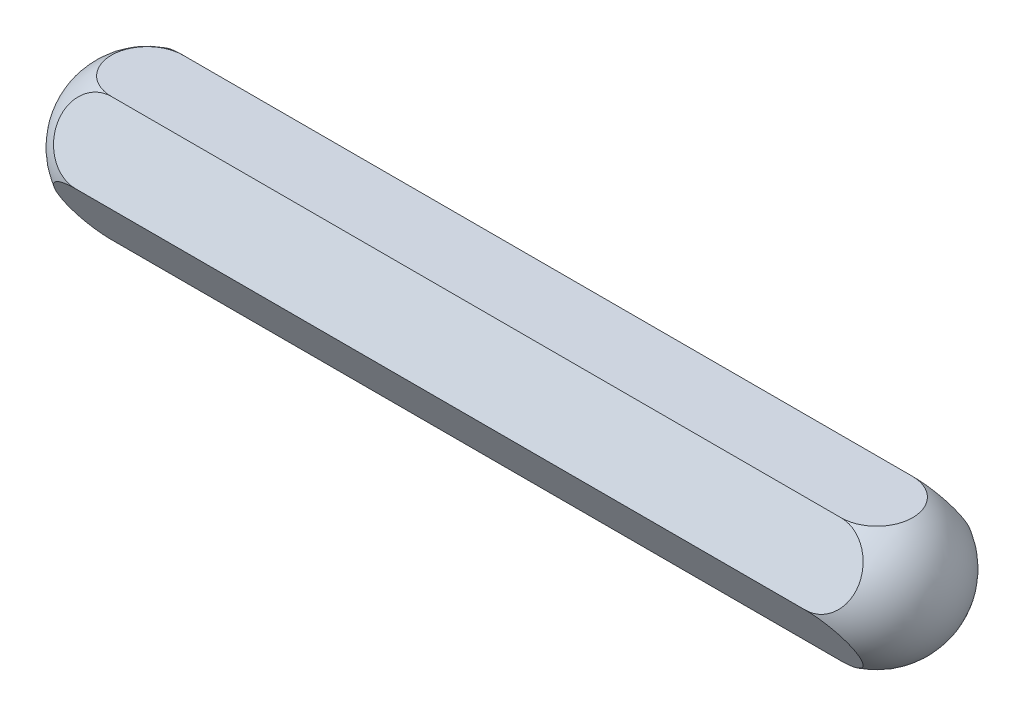
ISO-10303-21;
HEADER;
FILE_DESCRIPTION(('STEP AP214'),'2;1');
FILE_NAME('part.step','',(''),(''),'','','');
FILE_SCHEMA(('AUTOMOTIVE_DESIGN { 1 0 10303 214 1 1 1 1 }'));
ENDSEC;
DATA;
#1=APPLICATION_CONTEXT('core data for automotive mechanical design processes');
#2=APPLICATION_PROTOCOL_DEFINITION('international standard','automotive_design',2000,#1);
#3=PRODUCT_CONTEXT('',#1,'mechanical');
#4=PRODUCT('Part','Part','',(#3));
#5=PRODUCT_RELATED_PRODUCT_CATEGORY('part','',(#4));
#6=PRODUCT_DEFINITION_FORMATION('','',#4);
#7=PRODUCT_DEFINITION_CONTEXT('part definition',#1,'design');
#8=PRODUCT_DEFINITION('design','',#6,#7);
#9=PRODUCT_DEFINITION_SHAPE('','',#8);
#10=(LENGTH_UNIT() NAMED_UNIT(*) SI_UNIT(.MILLI.,.METRE.));
#11=(NAMED_UNIT(*) PLANE_ANGLE_UNIT() SI_UNIT($,.RADIAN.));
#12=(NAMED_UNIT(*) SI_UNIT($,.STERADIAN.) SOLID_ANGLE_UNIT());
#13=UNCERTAINTY_MEASURE_WITH_UNIT(LENGTH_MEASURE(1.E-05),#10,'distance_accuracy_value','');
#14=(GEOMETRIC_REPRESENTATION_CONTEXT(3) GLOBAL_UNCERTAINTY_ASSIGNED_CONTEXT((#13)) GLOBAL_UNIT_ASSIGNED_CONTEXT((#10,
#11,#12)) REPRESENTATION_CONTEXT('',''));
#15=CARTESIAN_POINT('',(0.,0.,0.));
#16=DIRECTION('',(0.,0.,1.));
#17=DIRECTION('',(1.,0.,0.));
#18=AXIS2_PLACEMENT_3D('',#15,#16,#17);
#19=CARTESIAN_POINT('',(-21.4,0.,0.));
#20=DIRECTION('',(-1.,0.,0.));
#21=DIRECTION('',(0.,1.,0.));
#22=AXIS2_PLACEMENT_3D('',#19,#20,#21);
#23=SPHERICAL_SURFACE('',#22,4.2);
#24=CARTESIAN_POINT('',(-21.4,-1.81865334794732,3.15));
#25=DIRECTION('',(0.,-0.5,0.866025403784439));
#26=DIRECTION('',(0.,-0.866025403784439,-0.5));
#27=AXIS2_PLACEMENT_3D('',#24,#25,#26);
#28=CIRCLE('',#27,2.10000000000001);
#29=CARTESIAN_POINT('',(-21.4,0.,4.2));
#30=VERTEX_POINT('',#29);
#31=CARTESIAN_POINT('',(-21.4,-3.63730669589463,2.1));
#32=VERTEX_POINT('',#31);
#33=EDGE_CURVE('E137',#30,#32,#28,.T.);
#34=ORIENTED_EDGE('',*,*,#33,.F.);
#35=CARTESIAN_POINT('',(-21.4,1.81865334794732,3.15));
#36=DIRECTION('',(0.,0.5,0.866025403784439));
#37=DIRECTION('',(0.,-0.866025403784439,0.5));
#38=AXIS2_PLACEMENT_3D('',#35,#36,#37);
#39=CIRCLE('',#38,2.1);
#40=CARTESIAN_POINT('',(-21.4,3.63730669589465,2.1));
#41=VERTEX_POINT('',#40);
#42=EDGE_CURVE('E181',#41,#30,#39,.T.);
#43=ORIENTED_EDGE('',*,*,#42,.F.);
#44=CARTESIAN_POINT('',(-21.4,3.63730669589465,0.));
#45=DIRECTION('',(0.,1.,0.));
#46=DIRECTION('',(0.,0.,1.));
#47=AXIS2_PLACEMENT_3D('',#44,#45,#46);
#48=CIRCLE('',#47,2.09999999999999);
#49=CARTESIAN_POINT('',(-21.4,3.63730669589465,-2.1));
#50=VERTEX_POINT('',#49);
#51=EDGE_CURVE('E110',#50,#41,#48,.T.);
#52=ORIENTED_EDGE('',*,*,#51,.F.);
#53=CARTESIAN_POINT('',(-21.4,1.81865334794732,-3.15));
#54=DIRECTION('',(0.,0.5,-0.866025403784439));
#55=DIRECTION('',(0.,0.866025403784439,0.5));
#56=AXIS2_PLACEMENT_3D('',#53,#54,#55);
#57=CIRCLE('',#56,2.1);
#58=CARTESIAN_POINT('',(-21.4,0.,-4.2));
#59=VERTEX_POINT('',#58);
#60=EDGE_CURVE('E169',#59,#50,#57,.T.);
#61=ORIENTED_EDGE('',*,*,#60,.F.);
#62=CARTESIAN_POINT('',(-21.4,-1.81865334794732,-3.15));
#63=DIRECTION('',(0.,-0.5,-0.866025403784439));
#64=DIRECTION('',(0.,0.866025403784439,-0.5));
#65=AXIS2_PLACEMENT_3D('',#62,#63,#64);
#66=CIRCLE('',#65,2.10000000000001);
#67=CARTESIAN_POINT('',(-21.4,-3.63730669589463,-2.1));
#68=VERTEX_POINT('',#67);
#69=EDGE_CURVE('E162',#68,#59,#66,.T.);
#70=ORIENTED_EDGE('',*,*,#69,.F.);
#71=CARTESIAN_POINT('',(-21.4,-3.63730669589463,0.));
#72=DIRECTION('',(0.,-1.,0.));
#73=DIRECTION('',(0.,0.,-1.));
#74=AXIS2_PLACEMENT_3D('',#71,#72,#73);
#75=CIRCLE('',#74,2.10000000000001);
#76=EDGE_CURVE('E153',#32,#68,#75,.T.);
#77=ORIENTED_EDGE('',*,*,#76,.F.);
#78=EDGE_LOOP('',(#34,#43,#52,#61,#70,#77));
#79=FACE_BOUND('',#78,.T.);
#80=ADVANCED_FACE('F87',(#79),#23,.T.);
#81=CARTESIAN_POINT('',(21.4,0.,0.));
#82=DIRECTION('',(-1.,0.,0.));
#83=DIRECTION('',(0.,1.,0.));
#84=AXIS2_PLACEMENT_3D('',#81,#82,#83);
#85=SPHERICAL_SURFACE('',#84,4.2);
#86=CARTESIAN_POINT('',(21.4,-1.81865334794731,3.15));
#87=DIRECTION('',(0.,-0.5,0.866025403784439));
#88=DIRECTION('',(0.,-0.866025403784439,-0.5));
#89=AXIS2_PLACEMENT_3D('',#86,#87,#88);
#90=CIRCLE('',#89,2.1);
#91=CARTESIAN_POINT('',(21.4,-3.63730669589463,2.1));
#92=VERTEX_POINT('',#91);
#93=CARTESIAN_POINT('',(21.4,0.,4.2));
#94=VERTEX_POINT('',#93);
#95=EDGE_CURVE('E102',#92,#94,#90,.T.);
#96=ORIENTED_EDGE('',*,*,#95,.F.);
#97=CARTESIAN_POINT('',(21.4,-3.63730669589463,0.));
#98=DIRECTION('',(0.,-1.,0.));
#99=DIRECTION('',(0.,0.,-1.));
#100=AXIS2_PLACEMENT_3D('',#97,#98,#99);
#101=CIRCLE('',#100,2.1);
#102=CARTESIAN_POINT('',(21.4,-3.63730669589463,-2.1));
#103=VERTEX_POINT('',#102);
#104=EDGE_CURVE('E155',#103,#92,#101,.T.);
#105=ORIENTED_EDGE('',*,*,#104,.F.);
#106=CARTESIAN_POINT('',(21.4,-1.81865334794731,-3.15));
#107=DIRECTION('',(0.,-0.5,-0.866025403784439));
#108=DIRECTION('',(0.,0.866025403784439,-0.5));
#109=AXIS2_PLACEMENT_3D('',#106,#107,#108);
#110=CIRCLE('',#109,2.1);
#111=CARTESIAN_POINT('',(21.4,0.,-4.2));
#112=VERTEX_POINT('',#111);
#113=EDGE_CURVE('E146',#112,#103,#110,.T.);
#114=ORIENTED_EDGE('',*,*,#113,.F.);
#115=CARTESIAN_POINT('',(21.4,1.81865334794733,-3.15));
#116=DIRECTION('',(0.,0.5,-0.866025403784439));
#117=DIRECTION('',(0.,0.866025403784439,0.5));
#118=AXIS2_PLACEMENT_3D('',#115,#116,#117);
#119=CIRCLE('',#118,2.1);
#120=CARTESIAN_POINT('',(21.4,3.63730669589465,-2.1));
#121=VERTEX_POINT('',#120);
#122=EDGE_CURVE('E164',#121,#112,#119,.T.);
#123=ORIENTED_EDGE('',*,*,#122,.F.);
#124=CARTESIAN_POINT('',(21.4,3.63730669589465,0.));
#125=DIRECTION('',(0.,1.,0.));
#126=DIRECTION('',(0.,0.,1.));
#127=AXIS2_PLACEMENT_3D('',#124,#125,#126);
#128=CIRCLE('',#127,2.1);
#129=CARTESIAN_POINT('',(21.4,3.63730669589465,2.1));
#130=VERTEX_POINT('',#129);
#131=EDGE_CURVE('E200',#130,#121,#128,.T.);
#132=ORIENTED_EDGE('',*,*,#131,.F.);
#133=CARTESIAN_POINT('',(21.4,1.81865334794733,3.15));
#134=DIRECTION('',(0.,0.5,0.866025403784439));
#135=DIRECTION('',(0.,-0.866025403784439,0.5));
#136=AXIS2_PLACEMENT_3D('',#133,#134,#135);
#137=CIRCLE('',#136,2.1);
#138=EDGE_CURVE('E177',#94,#130,#137,.T.);
#139=ORIENTED_EDGE('',*,*,#138,.F.);
#140=EDGE_LOOP('',(#96,#105,#114,#123,#132,#139));
#141=FACE_BOUND('',#140,.T.);
#142=ADVANCED_FACE('F198',(#141),#85,.T.);
#143=CARTESIAN_POINT('',(-25.6,-3.63730669589463,0.));
#144=DIRECTION('',(0.,-1.,0.));
#145=DIRECTION('',(0.,0.,-1.));
#146=AXIS2_PLACEMENT_3D('',#143,#144,#145);
#147=PLANE('',#146);
#148=ORIENTED_EDGE('',*,*,#76,.T.);
#149=DIRECTION('',(-1.,0.,0.));
#150=VECTOR('',#149,1.);
#151=CARTESIAN_POINT('',(-25.6,-3.63730669589463,-2.10000000000002));
#152=LINE('',#151,#150);
#153=EDGE_CURVE('E158',#68,#103,#152,.F.);
#154=ORIENTED_EDGE('',*,*,#153,.T.);
#155=ORIENTED_EDGE('',*,*,#104,.T.);
#156=DIRECTION('',(-1.,0.,0.));
#157=VECTOR('',#156,1.);
#158=CARTESIAN_POINT('',(-25.6,-3.63730669589463,2.10000000000001));
#159=LINE('',#158,#157);
#160=EDGE_CURVE('E140',#92,#32,#159,.T.);
#161=ORIENTED_EDGE('',*,*,#160,.T.);
#162=EDGE_LOOP('',(#148,#154,#155,#161));
#163=FACE_BOUND('',#162,.T.);
#164=ADVANCED_FACE('F151',(#163),#147,.T.);
#165=CARTESIAN_POINT('',(-25.6,1.81865334794732,-3.15));
#166=DIRECTION('',(0.,0.5,-0.866025403784439));
#167=DIRECTION('',(0.,0.866025403784439,0.5));
#168=AXIS2_PLACEMENT_3D('',#165,#166,#167);
#169=PLANE('',#168);
#170=ORIENTED_EDGE('',*,*,#60,.T.);
#171=DIRECTION('',(-1.,0.,0.));
#172=VECTOR('',#171,1.);
#173=CARTESIAN_POINT('',(-25.6,3.63730669589464,-2.10000000000001));
#174=LINE('',#173,#172);
#175=EDGE_CURVE('E157',#50,#121,#174,.F.);
#176=ORIENTED_EDGE('',*,*,#175,.T.);
#177=ORIENTED_EDGE('',*,*,#122,.T.);
#178=DIRECTION('',(-1.,0.,0.));
#179=VECTOR('',#178,1.);
#180=CARTESIAN_POINT('',(-25.6,0.,-4.2));
#181=LINE('',#180,#179);
#182=EDGE_CURVE('E189',#112,#59,#181,.T.);
#183=ORIENTED_EDGE('',*,*,#182,.T.);
#184=EDGE_LOOP('',(#170,#176,#177,#183));
#185=FACE_BOUND('',#184,.T.);
#186=ADVANCED_FACE('F214',(#185),#169,.T.);
#187=CARTESIAN_POINT('',(-25.6,1.81865334794732,3.15));
#188=DIRECTION('',(0.,0.5,0.866025403784439));
#189=DIRECTION('',(0.,-0.866025403784439,0.5));
#190=AXIS2_PLACEMENT_3D('',#187,#188,#189);
#191=PLANE('',#190);
#192=ORIENTED_EDGE('',*,*,#42,.T.);
#193=DIRECTION('',(-1.,0.,0.));
#194=VECTOR('',#193,1.);
#195=CARTESIAN_POINT('',(-25.6,0.,4.2));
#196=LINE('',#195,#194);
#197=EDGE_CURVE('E95',#30,#94,#196,.F.);
#198=ORIENTED_EDGE('',*,*,#197,.T.);
#199=ORIENTED_EDGE('',*,*,#138,.T.);
#200=DIRECTION('',(-1.,0.,0.));
#201=VECTOR('',#200,1.);
#202=CARTESIAN_POINT('',(-25.6,3.63730669589464,2.1));
#203=LINE('',#202,#201);
#204=EDGE_CURVE('E12',#130,#41,#203,.T.);
#205=ORIENTED_EDGE('',*,*,#204,.T.);
#206=EDGE_LOOP('',(#192,#198,#199,#205));
#207=FACE_BOUND('',#206,.T.);
#208=ADVANCED_FACE('F195',(#207),#191,.T.);
#209=CARTESIAN_POINT('',(-25.6,3.63730669589465,0.));
#210=DIRECTION('',(0.,1.,0.));
#211=DIRECTION('',(0.,0.,1.));
#212=AXIS2_PLACEMENT_3D('',#209,#210,#211);
#213=PLANE('',#212);
#214=ORIENTED_EDGE('',*,*,#51,.T.);
#215=ORIENTED_EDGE('',*,*,#204,.F.);
#216=ORIENTED_EDGE('',*,*,#131,.T.);
#217=ORIENTED_EDGE('',*,*,#175,.F.);
#218=EDGE_LOOP('',(#214,#215,#216,#217));
#219=FACE_BOUND('',#218,.T.);
#220=ADVANCED_FACE('F215',(#219),#213,.T.);
#221=CARTESIAN_POINT('',(-25.6,-1.81865334794732,-3.15));
#222=DIRECTION('',(0.,-0.5,-0.866025403784439));
#223=DIRECTION('',(0.,0.866025403784439,-0.5));
#224=AXIS2_PLACEMENT_3D('',#221,#222,#223);
#225=PLANE('',#224);
#226=ORIENTED_EDGE('',*,*,#69,.T.);
#227=ORIENTED_EDGE('',*,*,#182,.F.);
#228=ORIENTED_EDGE('',*,*,#113,.T.);
#229=ORIENTED_EDGE('',*,*,#153,.F.);
#230=EDGE_LOOP('',(#226,#227,#228,#229));
#231=FACE_BOUND('',#230,.T.);
#232=ADVANCED_FACE('F212',(#231),#225,.T.);
#233=CARTESIAN_POINT('',(-25.6,-1.81865334794732,3.15));
#234=DIRECTION('',(0.,-0.5,0.866025403784439));
#235=DIRECTION('',(0.,-0.866025403784439,-0.5));
#236=AXIS2_PLACEMENT_3D('',#233,#234,#235);
#237=PLANE('',#236);
#238=ORIENTED_EDGE('',*,*,#33,.T.);
#239=ORIENTED_EDGE('',*,*,#160,.F.);
#240=ORIENTED_EDGE('',*,*,#95,.T.);
#241=ORIENTED_EDGE('',*,*,#197,.F.);
#242=EDGE_LOOP('',(#238,#239,#240,#241));
#243=FACE_BOUND('',#242,.T.);
#244=ADVANCED_FACE('F139',(#243),#237,.T.);
#245=CLOSED_SHELL('',(#80,#142,#164,#186,#208,#220,#232,#244));
#246=MANIFOLD_SOLID_BREP('B2',#245);
#247=ADVANCED_BREP_SHAPE_REPRESENTATION('',(#18,#246),#14);
#248=SHAPE_DEFINITION_REPRESENTATION(#9,#247);
ENDSEC;
END-ISO-10303-21;
